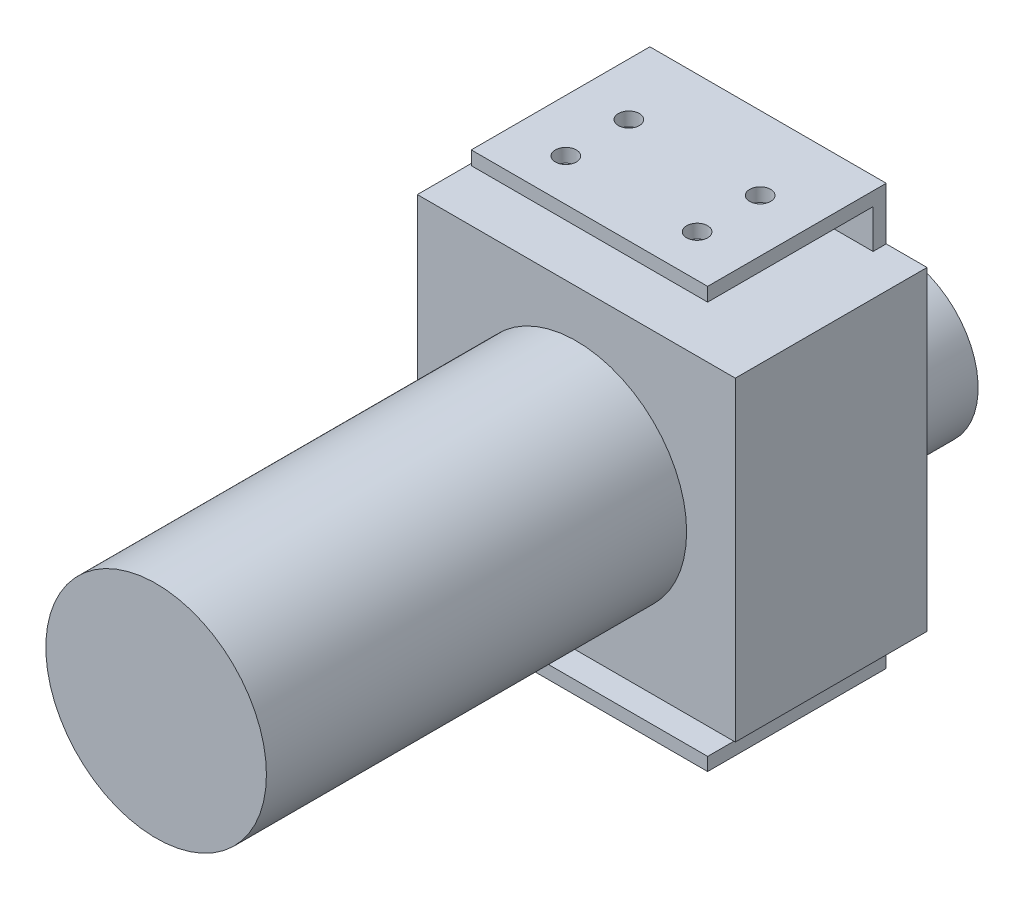
ISO-10303-21;
HEADER;
FILE_DESCRIPTION(('STEP AP214'),'2;1');
FILE_NAME('part.step','',(''),(''),'','','');
FILE_SCHEMA(('AUTOMOTIVE_DESIGN { 1 0 10303 214 1 1 1 1 }'));
ENDSEC;
DATA;
#1=APPLICATION_CONTEXT('core data for automotive mechanical design processes');
#2=APPLICATION_PROTOCOL_DEFINITION('international standard','automotive_design',2000,#1);
#3=PRODUCT_CONTEXT('',#1,'mechanical');
#4=PRODUCT('Part','Part','',(#3));
#5=PRODUCT_RELATED_PRODUCT_CATEGORY('part','',(#4));
#6=PRODUCT_DEFINITION_FORMATION('','',#4);
#7=PRODUCT_DEFINITION_CONTEXT('part definition',#1,'design');
#8=PRODUCT_DEFINITION('design','',#6,#7);
#9=PRODUCT_DEFINITION_SHAPE('','',#8);
#10=(LENGTH_UNIT() NAMED_UNIT(*) SI_UNIT(.MILLI.,.METRE.));
#11=(NAMED_UNIT(*) PLANE_ANGLE_UNIT() SI_UNIT($,.RADIAN.));
#12=(NAMED_UNIT(*) SI_UNIT($,.STERADIAN.) SOLID_ANGLE_UNIT());
#13=UNCERTAINTY_MEASURE_WITH_UNIT(LENGTH_MEASURE(1.E-05),#10,'distance_accuracy_value','');
#14=(GEOMETRIC_REPRESENTATION_CONTEXT(3) GLOBAL_UNCERTAINTY_ASSIGNED_CONTEXT((#13)) GLOBAL_UNIT_ASSIGNED_CONTEXT((#10,
#11,#12)) REPRESENTATION_CONTEXT('',''));
#15=CARTESIAN_POINT('',(0.,0.,0.));
#16=DIRECTION('',(0.,0.,1.));
#17=DIRECTION('',(1.,0.,0.));
#18=AXIS2_PLACEMENT_3D('',#15,#16,#17);
#19=CARTESIAN_POINT('',(0.,0.,2.5));
#20=DIRECTION('',(0.,0.,-1.));
#21=DIRECTION('',(-1.,0.,0.));
#22=AXIS2_PLACEMENT_3D('',#19,#20,#21);
#23=PLANE('',#22);
#24=DIRECTION('',(1.,0.,0.));
#25=VECTOR('',#24,1.);
#26=CARTESIAN_POINT('',(30.2680497080796,-30.,2.5));
#27=LINE('',#26,#25);
#28=CARTESIAN_POINT('',(-22.5,-30.,2.5));
#29=VERTEX_POINT('',#28);
#30=CARTESIAN_POINT('',(22.5,-30.,2.5));
#31=VERTEX_POINT('',#30);
#32=EDGE_CURVE('E200',#29,#31,#27,.T.);
#33=ORIENTED_EDGE('',*,*,#32,.F.);
#34=DIRECTION('',(0.,-1.,0.));
#35=VECTOR('',#34,1.);
#36=CARTESIAN_POINT('',(-22.5,-30.,2.5));
#37=LINE('',#36,#35);
#38=CARTESIAN_POINT('',(-22.5,-37.5,2.5));
#39=VERTEX_POINT('',#38);
#40=EDGE_CURVE('E253',#29,#39,#37,.T.);
#41=ORIENTED_EDGE('',*,*,#40,.T.);
#42=DIRECTION('',(-1.,0.,0.));
#43=VECTOR('',#42,1.);
#44=CARTESIAN_POINT('',(0.,-37.5,2.5));
#45=LINE('',#44,#43);
#46=CARTESIAN_POINT('',(22.5,-37.5,2.5));
#47=VERTEX_POINT('',#46);
#48=EDGE_CURVE('E64',#47,#39,#45,.T.);
#49=ORIENTED_EDGE('',*,*,#48,.F.);
#50=DIRECTION('',(0.,1.,0.));
#51=VECTOR('',#50,1.);
#52=CARTESIAN_POINT('',(22.5,-40.,2.5));
#53=LINE('',#52,#51);
#54=EDGE_CURVE('E121',#47,#31,#53,.T.);
#55=ORIENTED_EDGE('',*,*,#54,.T.);
#56=EDGE_LOOP('',(#33,#41,#49,#55));
#57=FACE_BOUND('',#56,.T.);
#58=ADVANCED_FACE('F47',(#57),#23,.F.);
#59=DIRECTION('',(-1.,0.,0.));
#60=VECTOR('',#59,1.);
#61=CARTESIAN_POINT('',(-30.2680497080796,30.,2.5));
#62=LINE('',#61,#60);
#63=CARTESIAN_POINT('',(22.5,30.,2.5));
#64=VERTEX_POINT('',#63);
#65=CARTESIAN_POINT('',(-22.5,30.,2.5));
#66=VERTEX_POINT('',#65);
#67=EDGE_CURVE('E197',#64,#66,#62,.T.);
#68=ORIENTED_EDGE('',*,*,#67,.F.);
#69=DIRECTION('',(0.,-1.,0.));
#70=VECTOR('',#69,1.);
#71=CARTESIAN_POINT('',(22.5,40.,2.5));
#72=LINE('',#71,#70);
#73=CARTESIAN_POINT('',(22.5,37.3974056643438,2.5));
#74=VERTEX_POINT('',#73);
#75=EDGE_CURVE('E248',#74,#64,#72,.T.);
#76=ORIENTED_EDGE('',*,*,#75,.F.);
#77=DIRECTION('',(-1.,0.,0.));
#78=VECTOR('',#77,1.);
#79=CARTESIAN_POINT('',(22.5,37.3974056643438,2.5));
#80=LINE('',#79,#78);
#81=CARTESIAN_POINT('',(-22.5,37.3974056643438,2.5));
#82=VERTEX_POINT('',#81);
#83=EDGE_CURVE('E214',#74,#82,#80,.T.);
#84=ORIENTED_EDGE('',*,*,#83,.T.);
#85=DIRECTION('',(0.,1.,0.));
#86=VECTOR('',#85,1.);
#87=CARTESIAN_POINT('',(-22.5,30.,2.5));
#88=LINE('',#87,#86);
#89=EDGE_CURVE('E251',#66,#82,#88,.T.);
#90=ORIENTED_EDGE('',*,*,#89,.F.);
#91=EDGE_LOOP('',(#68,#76,#84,#90));
#92=FACE_BOUND('',#91,.T.);
#93=ADVANCED_FACE('F378',(#92),#23,.F.);
#94=CARTESIAN_POINT('',(22.5,-40.,2.5));
#95=DIRECTION('',(-1.,0.,0.));
#96=DIRECTION('',(0.,0.,1.));
#97=AXIS2_PLACEMENT_3D('',#94,#95,#96);
#98=PLANE('',#97);
#99=DIRECTION('',(0.,1.,0.));
#100=VECTOR('',#99,1.);
#101=CARTESIAN_POINT('',(22.5,-40.,0.));
#102=LINE('',#101,#100);
#103=CARTESIAN_POINT('',(22.5,-40.,0.));
#104=VERTEX_POINT('',#103);
#105=CARTESIAN_POINT('',(22.5,-30.,0.));
#106=VERTEX_POINT('',#105);
#107=EDGE_CURVE('E246',#104,#106,#102,.T.);
#108=ORIENTED_EDGE('',*,*,#107,.T.);
#109=DIRECTION('',(0.,0.,-1.));
#110=VECTOR('',#109,1.);
#111=CARTESIAN_POINT('',(22.5,-30.,2.5));
#112=LINE('',#111,#110);
#113=EDGE_CURVE('E56',#31,#106,#112,.T.);
#114=ORIENTED_EDGE('',*,*,#113,.F.);
#115=ORIENTED_EDGE('',*,*,#54,.F.);
#116=DIRECTION('',(0.,0.,-1.));
#117=VECTOR('',#116,1.);
#118=CARTESIAN_POINT('',(22.5,-37.5,34.));
#119=LINE('',#118,#117);
#120=CARTESIAN_POINT('',(22.5,-37.5,34.));
#121=VERTEX_POINT('',#120);
#122=EDGE_CURVE('E243',#121,#47,#119,.T.);
#123=ORIENTED_EDGE('',*,*,#122,.F.);
#124=DIRECTION('',(0.,1.,0.));
#125=VECTOR('',#124,1.);
#126=CARTESIAN_POINT('',(22.5,0.,34.));
#127=LINE('',#126,#125);
#128=CARTESIAN_POINT('',(22.5,-40.,34.));
#129=VERTEX_POINT('',#128);
#130=EDGE_CURVE('E228',#129,#121,#127,.T.);
#131=ORIENTED_EDGE('',*,*,#130,.F.);
#132=DIRECTION('',(0.,0.,-1.));
#133=VECTOR('',#132,1.);
#134=CARTESIAN_POINT('',(22.5,-40.,2.5));
#135=LINE('',#134,#133);
#136=EDGE_CURVE('E255',#129,#104,#135,.T.);
#137=ORIENTED_EDGE('',*,*,#136,.T.);
#138=EDGE_LOOP('',(#108,#114,#115,#123,#131,#137));
#139=FACE_BOUND('',#138,.T.);
#140=ADVANCED_FACE('F49',(#139),#98,.F.);
#141=CARTESIAN_POINT('',(30.2680497080796,-30.,2.5));
#142=DIRECTION('',(-1.,0.,0.));
#143=DIRECTION('',(0.,0.,1.));
#144=AXIS2_PLACEMENT_3D('',#141,#142,#143);
#145=PLANE('',#144);
#146=DIRECTION('',(0.,1.,0.));
#147=VECTOR('',#146,1.);
#148=CARTESIAN_POINT('',(30.2680497080796,-30.,0.));
#149=LINE('',#148,#147);
#150=CARTESIAN_POINT('',(30.2680497080796,-30.,0.));
#151=VERTEX_POINT('',#150);
#152=CARTESIAN_POINT('',(30.2680497080796,30.,0.));
#153=VERTEX_POINT('',#152);
#154=EDGE_CURVE('E260',#151,#153,#149,.T.);
#155=ORIENTED_EDGE('',*,*,#154,.T.);
#156=DIRECTION('',(0.,0.,-1.));
#157=VECTOR('',#156,1.);
#158=CARTESIAN_POINT('',(30.2680497080796,30.,2.5));
#159=LINE('',#158,#157);
#160=CARTESIAN_POINT('',(30.2680497080796,30.,36.5));
#161=VERTEX_POINT('',#160);
#162=EDGE_CURVE('E297',#161,#153,#159,.T.);
#163=ORIENTED_EDGE('',*,*,#162,.F.);
#164=DIRECTION('',(0.,1.,0.));
#165=VECTOR('',#164,1.);
#166=CARTESIAN_POINT('',(30.2680497080796,30.,36.5));
#167=LINE('',#166,#165);
#168=CARTESIAN_POINT('',(30.2680497080796,-30.,36.5));
#169=VERTEX_POINT('',#168);
#170=EDGE_CURVE('E191',#169,#161,#167,.T.);
#171=ORIENTED_EDGE('',*,*,#170,.F.);
#172=DIRECTION('',(0.,0.,-1.));
#173=VECTOR('',#172,1.);
#174=CARTESIAN_POINT('',(30.2680497080796,-30.,2.5));
#175=LINE('',#174,#173);
#176=EDGE_CURVE('E187',#169,#151,#175,.T.);
#177=ORIENTED_EDGE('',*,*,#176,.T.);
#178=EDGE_LOOP('',(#155,#163,#171,#177));
#179=FACE_BOUND('',#178,.T.);
#180=ADVANCED_FACE('F416',(#179),#145,.F.);
#181=CARTESIAN_POINT('',(22.5,40.,2.5));
#182=DIRECTION('',(1.,0.,0.));
#183=DIRECTION('',(0.,0.,-1.));
#184=AXIS2_PLACEMENT_3D('',#181,#182,#183);
#185=PLANE('',#184);
#186=DIRECTION('',(0.,-1.,0.));
#187=VECTOR('',#186,1.);
#188=CARTESIAN_POINT('',(22.5,40.,0.));
#189=LINE('',#188,#187);
#190=CARTESIAN_POINT('',(22.5,40.,0.));
#191=VERTEX_POINT('',#190);
#192=CARTESIAN_POINT('',(22.5,30.,0.));
#193=VERTEX_POINT('',#192);
#194=EDGE_CURVE('E266',#191,#193,#189,.T.);
#195=ORIENTED_EDGE('',*,*,#194,.F.);
#196=DIRECTION('',(0.,0.,-1.));
#197=VECTOR('',#196,1.);
#198=CARTESIAN_POINT('',(22.5,40.,2.5));
#199=LINE('',#198,#197);
#200=CARTESIAN_POINT('',(22.5,40.,34.));
#201=VERTEX_POINT('',#200);
#202=EDGE_CURVE('E293',#201,#191,#199,.T.);
#203=ORIENTED_EDGE('',*,*,#202,.F.);
#204=DIRECTION('',(0.,-1.,0.));
#205=VECTOR('',#204,1.);
#206=CARTESIAN_POINT('',(22.5,40.,34.));
#207=LINE('',#206,#205);
#208=CARTESIAN_POINT('',(22.5,37.3974056643438,34.));
#209=VERTEX_POINT('',#208);
#210=EDGE_CURVE('E212',#201,#209,#207,.T.);
#211=ORIENTED_EDGE('',*,*,#210,.T.);
#212=DIRECTION('',(0.,0.,-1.));
#213=VECTOR('',#212,1.);
#214=CARTESIAN_POINT('',(22.5,37.3974056643438,34.));
#215=LINE('',#214,#213);
#216=EDGE_CURVE('E206',#209,#74,#215,.T.);
#217=ORIENTED_EDGE('',*,*,#216,.T.);
#218=ORIENTED_EDGE('',*,*,#75,.T.);
#219=DIRECTION('',(0.,0.,-1.));
#220=VECTOR('',#219,1.);
#221=CARTESIAN_POINT('',(22.5,30.,2.5));
#222=LINE('',#221,#220);
#223=EDGE_CURVE('E295',#64,#193,#222,.T.);
#224=ORIENTED_EDGE('',*,*,#223,.T.);
#225=EDGE_LOOP('',(#195,#203,#211,#217,#218,#224));
#226=FACE_BOUND('',#225,.T.);
#227=ADVANCED_FACE('F413',(#226),#185,.T.);
#228=CARTESIAN_POINT('',(-22.5,40.,2.5));
#229=DIRECTION('',(0.,1.,0.));
#230=DIRECTION('',(0.,0.,1.));
#231=AXIS2_PLACEMENT_3D('',#228,#229,#230);
#232=PLANE('',#231);
#233=CARTESIAN_POINT('',(12.5,40.,14.));
#234=DIRECTION('',(0.,1.,0.));
#235=DIRECTION('',(0.,0.,1.));
#236=AXIS2_PLACEMENT_3D('',#233,#234,#235);
#237=CIRCLE('',#236,2.);
#238=CARTESIAN_POINT('',(12.5,40.,16.));
#239=VERTEX_POINT('',#238);
#240=EDGE_CURVE('E336',#239,#239,#237,.T.);
#241=ORIENTED_EDGE('',*,*,#240,.F.);
#242=EDGE_LOOP('',(#241));
#243=FACE_BOUND('',#242,.T.);
#244=CARTESIAN_POINT('',(-12.5,40.,26.));
#245=DIRECTION('',(0.,1.,0.));
#246=DIRECTION('',(0.,0.,1.));
#247=AXIS2_PLACEMENT_3D('',#244,#245,#246);
#248=CIRCLE('',#247,2.);
#249=CARTESIAN_POINT('',(-12.5,40.,28.));
#250=VERTEX_POINT('',#249);
#251=EDGE_CURVE('E331',#250,#250,#248,.T.);
#252=ORIENTED_EDGE('',*,*,#251,.F.);
#253=EDGE_LOOP('',(#252));
#254=FACE_BOUND('',#253,.T.);
#255=CARTESIAN_POINT('',(12.5,40.,26.));
#256=DIRECTION('',(0.,1.,0.));
#257=DIRECTION('',(0.,0.,1.));
#258=AXIS2_PLACEMENT_3D('',#255,#256,#257);
#259=CIRCLE('',#258,2.);
#260=CARTESIAN_POINT('',(12.5,40.,28.));
#261=VERTEX_POINT('',#260);
#262=EDGE_CURVE('E327',#261,#261,#259,.T.);
#263=ORIENTED_EDGE('',*,*,#262,.F.);
#264=EDGE_LOOP('',(#263));
#265=FACE_BOUND('',#264,.T.);
#266=CARTESIAN_POINT('',(-12.5,40.,14.));
#267=DIRECTION('',(0.,1.,0.));
#268=DIRECTION('',(0.,0.,1.));
#269=AXIS2_PLACEMENT_3D('',#266,#267,#268);
#270=CIRCLE('',#269,2.);
#271=CARTESIAN_POINT('',(-12.5,40.,16.));
#272=VERTEX_POINT('',#271);
#273=EDGE_CURVE('E306',#272,#272,#270,.T.);
#274=ORIENTED_EDGE('',*,*,#273,.F.);
#275=EDGE_LOOP('',(#274));
#276=FACE_BOUND('',#275,.T.);
#277=DIRECTION('',(1.,0.,0.));
#278=VECTOR('',#277,1.);
#279=CARTESIAN_POINT('',(-22.5,40.,0.));
#280=LINE('',#279,#278);
#281=CARTESIAN_POINT('',(-22.5,40.,0.));
#282=VERTEX_POINT('',#281);
#283=EDGE_CURVE('E269',#282,#191,#280,.T.);
#284=ORIENTED_EDGE('',*,*,#283,.F.);
#285=DIRECTION('',(0.,0.,-1.));
#286=VECTOR('',#285,1.);
#287=CARTESIAN_POINT('',(-22.5,40.,2.5));
#288=LINE('',#287,#286);
#289=CARTESIAN_POINT('',(-22.5,40.,34.));
#290=VERTEX_POINT('',#289);
#291=EDGE_CURVE('E291',#290,#282,#288,.T.);
#292=ORIENTED_EDGE('',*,*,#291,.F.);
#293=DIRECTION('',(1.,0.,0.));
#294=VECTOR('',#293,1.);
#295=CARTESIAN_POINT('',(-22.5,40.,34.));
#296=LINE('',#295,#294);
#297=EDGE_CURVE('E220',#290,#201,#296,.T.);
#298=ORIENTED_EDGE('',*,*,#297,.T.);
#299=ORIENTED_EDGE('',*,*,#202,.T.);
#300=EDGE_LOOP('',(#284,#292,#298,#299));
#301=FACE_BOUND('',#300,.T.);
#302=ADVANCED_FACE('F410',(#243,#254,#265,#276,#301),#232,.T.);
#303=CARTESIAN_POINT('',(-22.5,30.,2.5));
#304=DIRECTION('',(-1.,0.,0.));
#305=DIRECTION('',(0.,0.,1.));
#306=AXIS2_PLACEMENT_3D('',#303,#304,#305);
#307=PLANE('',#306);
#308=DIRECTION('',(0.,1.,0.));
#309=VECTOR('',#308,1.);
#310=CARTESIAN_POINT('',(-22.5,30.,0.));
#311=LINE('',#310,#309);
#312=CARTESIAN_POINT('',(-22.5,30.,0.));
#313=VERTEX_POINT('',#312);
#314=EDGE_CURVE('E272',#313,#282,#311,.T.);
#315=ORIENTED_EDGE('',*,*,#314,.F.);
#316=DIRECTION('',(0.,0.,-1.));
#317=VECTOR('',#316,1.);
#318=CARTESIAN_POINT('',(-22.5,30.,2.5));
#319=LINE('',#318,#317);
#320=EDGE_CURVE('E73',#66,#313,#319,.T.);
#321=ORIENTED_EDGE('',*,*,#320,.F.);
#322=ORIENTED_EDGE('',*,*,#89,.T.);
#323=DIRECTION('',(0.,0.,-1.));
#324=VECTOR('',#323,1.);
#325=CARTESIAN_POINT('',(-22.5,37.3974056643438,34.));
#326=LINE('',#325,#324);
#327=CARTESIAN_POINT('',(-22.5,37.3974056643438,34.));
#328=VERTEX_POINT('',#327);
#329=EDGE_CURVE('E210',#328,#82,#326,.T.);
#330=ORIENTED_EDGE('',*,*,#329,.F.);
#331=DIRECTION('',(0.,1.,0.));
#332=VECTOR('',#331,1.);
#333=CARTESIAN_POINT('',(-22.5,37.3974056643438,34.));
#334=LINE('',#333,#332);
#335=EDGE_CURVE('E223',#328,#290,#334,.T.);
#336=ORIENTED_EDGE('',*,*,#335,.T.);
#337=ORIENTED_EDGE('',*,*,#291,.T.);
#338=EDGE_LOOP('',(#315,#321,#322,#330,#336,#337));
#339=FACE_BOUND('',#338,.T.);
#340=ADVANCED_FACE('F406',(#339),#307,.T.);
#341=CARTESIAN_POINT('',(-30.2680497080796,30.,2.5));
#342=DIRECTION('',(0.,1.,0.));
#343=DIRECTION('',(0.,0.,1.));
#344=AXIS2_PLACEMENT_3D('',#341,#342,#343);
#345=PLANE('',#344);
#346=DIRECTION('',(1.,0.,0.));
#347=VECTOR('',#346,1.);
#348=CARTESIAN_POINT('',(-30.2680497080796,30.,0.));
#349=LINE('',#348,#347);
#350=CARTESIAN_POINT('',(-30.2680497080796,30.,0.));
#351=VERTEX_POINT('',#350);
#352=EDGE_CURVE('E275',#351,#313,#349,.T.);
#353=ORIENTED_EDGE('',*,*,#352,.F.);
#354=DIRECTION('',(0.,0.,-1.));
#355=VECTOR('',#354,1.);
#356=CARTESIAN_POINT('',(-30.2680497080796,30.,2.5));
#357=LINE('',#356,#355);
#358=CARTESIAN_POINT('',(-30.2680497080796,30.,36.5));
#359=VERTEX_POINT('',#358);
#360=EDGE_CURVE('E180',#359,#351,#357,.T.);
#361=ORIENTED_EDGE('',*,*,#360,.F.);
#362=DIRECTION('',(-1.,0.,0.));
#363=VECTOR('',#362,1.);
#364=CARTESIAN_POINT('',(-30.2680497080796,30.,36.5));
#365=LINE('',#364,#363);
#366=EDGE_CURVE('E196',#161,#359,#365,.T.);
#367=ORIENTED_EDGE('',*,*,#366,.F.);
#368=ORIENTED_EDGE('',*,*,#162,.T.);
#369=DIRECTION('',(1.,0.,0.));
#370=VECTOR('',#369,1.);
#371=CARTESIAN_POINT('',(22.5,30.,0.));
#372=LINE('',#371,#370);
#373=EDGE_CURVE('E263',#193,#153,#372,.T.);
#374=ORIENTED_EDGE('',*,*,#373,.F.);
#375=ORIENTED_EDGE('',*,*,#223,.F.);
#376=ORIENTED_EDGE('',*,*,#67,.T.);
#377=ORIENTED_EDGE('',*,*,#320,.T.);
#378=EDGE_LOOP('',(#353,#361,#367,#368,#374,#375,#376,#377));
#379=FACE_BOUND('',#378,.T.);
#380=ADVANCED_FACE('F403',(#379),#345,.T.);
#381=CARTESIAN_POINT('',(-30.2680497080796,-30.,2.5));
#382=DIRECTION('',(-1.,0.,0.));
#383=DIRECTION('',(0.,0.,1.));
#384=AXIS2_PLACEMENT_3D('',#381,#382,#383);
#385=PLANE('',#384);
#386=DIRECTION('',(0.,1.,0.));
#387=VECTOR('',#386,1.);
#388=CARTESIAN_POINT('',(-30.2680497080796,-30.,0.));
#389=LINE('',#388,#387);
#390=CARTESIAN_POINT('',(-30.2680497080796,-30.,0.));
#391=VERTEX_POINT('',#390);
#392=EDGE_CURVE('E177',#391,#351,#389,.T.);
#393=ORIENTED_EDGE('',*,*,#392,.F.);
#394=DIRECTION('',(0.,0.,-1.));
#395=VECTOR('',#394,1.);
#396=CARTESIAN_POINT('',(-30.2680497080796,-30.,2.5));
#397=LINE('',#396,#395);
#398=CARTESIAN_POINT('',(-30.2680497080796,-30.,36.5));
#399=VERTEX_POINT('',#398);
#400=EDGE_CURVE('E171',#399,#391,#397,.T.);
#401=ORIENTED_EDGE('',*,*,#400,.F.);
#402=DIRECTION('',(0.,-1.,0.));
#403=VECTOR('',#402,1.);
#404=CARTESIAN_POINT('',(-30.2680497080796,-30.,36.5));
#405=LINE('',#404,#403);
#406=EDGE_CURVE('E175',#359,#399,#405,.T.);
#407=ORIENTED_EDGE('',*,*,#406,.F.);
#408=ORIENTED_EDGE('',*,*,#360,.T.);
#409=EDGE_LOOP('',(#393,#401,#407,#408));
#410=FACE_BOUND('',#409,.T.);
#411=ADVANCED_FACE('F173',(#410),#385,.T.);
#412=CARTESIAN_POINT('',(-30.2680497080796,-30.,2.5));
#413=DIRECTION('',(0.,1.,0.));
#414=DIRECTION('',(0.,0.,1.));
#415=AXIS2_PLACEMENT_3D('',#412,#413,#414);
#416=PLANE('',#415);
#417=DIRECTION('',(1.,0.,0.));
#418=VECTOR('',#417,1.);
#419=CARTESIAN_POINT('',(-30.2680497080796,-30.,0.));
#420=LINE('',#419,#418);
#421=CARTESIAN_POINT('',(-22.5,-30.,0.));
#422=VERTEX_POINT('',#421);
#423=EDGE_CURVE('E279',#391,#422,#420,.T.);
#424=ORIENTED_EDGE('',*,*,#423,.T.);
#425=DIRECTION('',(0.,0.,-1.));
#426=VECTOR('',#425,1.);
#427=CARTESIAN_POINT('',(-22.5,-30.,2.5));
#428=LINE('',#427,#426);
#429=EDGE_CURVE('E181',#29,#422,#428,.T.);
#430=ORIENTED_EDGE('',*,*,#429,.F.);
#431=ORIENTED_EDGE('',*,*,#32,.T.);
#432=ORIENTED_EDGE('',*,*,#113,.T.);
#433=DIRECTION('',(1.,0.,0.));
#434=VECTOR('',#433,1.);
#435=CARTESIAN_POINT('',(22.5,-30.,0.));
#436=LINE('',#435,#434);
#437=EDGE_CURVE('E258',#106,#151,#436,.T.);
#438=ORIENTED_EDGE('',*,*,#437,.T.);
#439=ORIENTED_EDGE('',*,*,#176,.F.);
#440=DIRECTION('',(1.,0.,0.));
#441=VECTOR('',#440,1.);
#442=CARTESIAN_POINT('',(30.2680497080796,-30.,36.5));
#443=LINE('',#442,#441);
#444=EDGE_CURVE('E184',#399,#169,#443,.T.);
#445=ORIENTED_EDGE('',*,*,#444,.F.);
#446=ORIENTED_EDGE('',*,*,#400,.T.);
#447=EDGE_LOOP('',(#424,#430,#431,#432,#438,#439,#445,#446));
#448=FACE_BOUND('',#447,.T.);
#449=ADVANCED_FACE('F185',(#448),#416,.F.);
#450=CARTESIAN_POINT('',(-22.5,-30.,2.5));
#451=DIRECTION('',(1.,0.,0.));
#452=DIRECTION('',(0.,0.,-1.));
#453=AXIS2_PLACEMENT_3D('',#450,#451,#452);
#454=PLANE('',#453);
#455=DIRECTION('',(0.,-1.,0.));
#456=VECTOR('',#455,1.);
#457=CARTESIAN_POINT('',(-22.5,-30.,0.));
#458=LINE('',#457,#456);
#459=CARTESIAN_POINT('',(-22.5,-40.,0.));
#460=VERTEX_POINT('',#459);
#461=EDGE_CURVE('E281',#422,#460,#458,.T.);
#462=ORIENTED_EDGE('',*,*,#461,.T.);
#463=DIRECTION('',(0.,0.,-1.));
#464=VECTOR('',#463,1.);
#465=CARTESIAN_POINT('',(-22.5,-40.,2.5));
#466=LINE('',#465,#464);
#467=CARTESIAN_POINT('',(-22.5,-40.,34.));
#468=VERTEX_POINT('',#467);
#469=EDGE_CURVE('E285',#468,#460,#466,.T.);
#470=ORIENTED_EDGE('',*,*,#469,.F.);
#471=DIRECTION('',(0.,-1.,0.));
#472=VECTOR('',#471,1.);
#473=CARTESIAN_POINT('',(-22.5,0.,34.));
#474=LINE('',#473,#472);
#475=CARTESIAN_POINT('',(-22.5,-37.5,34.));
#476=VERTEX_POINT('',#475);
#477=EDGE_CURVE('E233',#476,#468,#474,.T.);
#478=ORIENTED_EDGE('',*,*,#477,.F.);
#479=DIRECTION('',(0.,0.,-1.));
#480=VECTOR('',#479,1.);
#481=CARTESIAN_POINT('',(-22.5,-37.5,34.));
#482=LINE('',#481,#480);
#483=EDGE_CURVE('E239',#476,#39,#482,.T.);
#484=ORIENTED_EDGE('',*,*,#483,.T.);
#485=ORIENTED_EDGE('',*,*,#40,.F.);
#486=ORIENTED_EDGE('',*,*,#429,.T.);
#487=EDGE_LOOP('',(#462,#470,#478,#484,#485,#486));
#488=FACE_BOUND('',#487,.T.);
#489=ADVANCED_FACE('F395',(#488),#454,.F.);
#490=CARTESIAN_POINT('',(-22.5,-40.,2.5));
#491=DIRECTION('',(0.,1.,0.));
#492=DIRECTION('',(0.,0.,1.));
#493=AXIS2_PLACEMENT_3D('',#490,#491,#492);
#494=PLANE('',#493);
#495=CARTESIAN_POINT('',(-12.5,-40.,26.));
#496=DIRECTION('',(0.,-1.,0.));
#497=DIRECTION('',(0.,0.,-1.));
#498=AXIS2_PLACEMENT_3D('',#495,#496,#497);
#499=CIRCLE('',#498,2.);
#500=CARTESIAN_POINT('',(-12.5,-40.,24.));
#501=VERTEX_POINT('',#500);
#502=EDGE_CURVE('E718',#501,#501,#499,.T.);
#503=ORIENTED_EDGE('',*,*,#502,.F.);
#504=EDGE_LOOP('',(#503));
#505=FACE_BOUND('',#504,.T.);
#506=CARTESIAN_POINT('',(-12.5,-40.,14.));
#507=DIRECTION('',(0.,-1.,0.));
#508=DIRECTION('',(0.,0.,-1.));
#509=AXIS2_PLACEMENT_3D('',#506,#507,#508);
#510=CIRCLE('',#509,2.);
#511=CARTESIAN_POINT('',(-12.5,-40.,12.));
#512=VERTEX_POINT('',#511);
#513=EDGE_CURVE('E719',#512,#512,#510,.T.);
#514=ORIENTED_EDGE('',*,*,#513,.F.);
#515=EDGE_LOOP('',(#514));
#516=FACE_BOUND('',#515,.T.);
#517=CARTESIAN_POINT('',(12.5,-40.,14.));
#518=DIRECTION('',(0.,-1.,0.));
#519=DIRECTION('',(0.,0.,-1.));
#520=AXIS2_PLACEMENT_3D('',#517,#518,#519);
#521=CIRCLE('',#520,2.);
#522=CARTESIAN_POINT('',(12.5,-40.,12.));
#523=VERTEX_POINT('',#522);
#524=EDGE_CURVE('E721',#523,#523,#521,.T.);
#525=ORIENTED_EDGE('',*,*,#524,.F.);
#526=EDGE_LOOP('',(#525));
#527=FACE_BOUND('',#526,.T.);
#528=CARTESIAN_POINT('',(12.5,-40.,26.));
#529=DIRECTION('',(0.,-1.,0.));
#530=DIRECTION('',(0.,0.,-1.));
#531=AXIS2_PLACEMENT_3D('',#528,#529,#530);
#532=CIRCLE('',#531,2.);
#533=CARTESIAN_POINT('',(12.5,-40.,24.));
#534=VERTEX_POINT('',#533);
#535=EDGE_CURVE('E320',#534,#534,#532,.T.);
#536=ORIENTED_EDGE('',*,*,#535,.F.);
#537=EDGE_LOOP('',(#536));
#538=FACE_BOUND('',#537,.T.);
#539=DIRECTION('',(1.,0.,0.));
#540=VECTOR('',#539,1.);
#541=CARTESIAN_POINT('',(-22.5,-40.,0.));
#542=LINE('',#541,#540);
#543=EDGE_CURVE('E118',#460,#104,#542,.T.);
#544=ORIENTED_EDGE('',*,*,#543,.T.);
#545=ORIENTED_EDGE('',*,*,#136,.F.);
#546=DIRECTION('',(1.,0.,0.));
#547=VECTOR('',#546,1.);
#548=CARTESIAN_POINT('',(0.,-40.,34.));
#549=LINE('',#548,#547);
#550=EDGE_CURVE('E236',#468,#129,#549,.T.);
#551=ORIENTED_EDGE('',*,*,#550,.F.);
#552=ORIENTED_EDGE('',*,*,#469,.T.);
#553=EDGE_LOOP('',(#544,#545,#551,#552));
#554=FACE_BOUND('',#553,.T.);
#555=ADVANCED_FACE('F391',(#505,#516,#527,#538,#554),#494,.F.);
#556=CARTESIAN_POINT('',(0.,0.,0.));
#557=DIRECTION('',(0.,0.,-1.));
#558=DIRECTION('',(-1.,0.,0.));
#559=AXIS2_PLACEMENT_3D('',#556,#557,#558);
#560=PLANE('',#559);
#561=CARTESIAN_POINT('',(0.,-9.99999999999999,0.));
#562=DIRECTION('',(0.,0.,-1.));
#563=DIRECTION('',(-1.,0.,0.));
#564=AXIS2_PLACEMENT_3D('',#561,#562,#563);
#565=CIRCLE('',#564,4.);
#566=CARTESIAN_POINT('',(-4.,-9.99999999999999,0.));
#567=VERTEX_POINT('',#566);
#568=EDGE_CURVE('E348',#567,#567,#565,.T.);
#569=ORIENTED_EDGE('',*,*,#568,.F.);
#570=EDGE_LOOP('',(#569));
#571=FACE_BOUND('',#570,.T.);
#572=ORIENTED_EDGE('',*,*,#107,.F.);
#573=ORIENTED_EDGE('',*,*,#543,.F.);
#574=ORIENTED_EDGE('',*,*,#461,.F.);
#575=ORIENTED_EDGE('',*,*,#423,.F.);
#576=ORIENTED_EDGE('',*,*,#392,.T.);
#577=ORIENTED_EDGE('',*,*,#352,.T.);
#578=ORIENTED_EDGE('',*,*,#314,.T.);
#579=ORIENTED_EDGE('',*,*,#283,.T.);
#580=ORIENTED_EDGE('',*,*,#194,.T.);
#581=ORIENTED_EDGE('',*,*,#373,.T.);
#582=ORIENTED_EDGE('',*,*,#154,.F.);
#583=ORIENTED_EDGE('',*,*,#437,.F.);
#584=EDGE_LOOP('',(#572,#573,#574,#575,#576,#577,#578,#579,#580,#581,#582,#583));
#585=FACE_BOUND('',#584,.T.);
#586=ADVANCED_FACE('F388',(#571,#585),#560,.T.);
#587=CARTESIAN_POINT('',(0.,-37.5,34.));
#588=DIRECTION('',(0.,-1.,0.));
#589=DIRECTION('',(0.,0.,-1.));
#590=AXIS2_PLACEMENT_3D('',#587,#588,#589);
#591=PLANE('',#590);
#592=CARTESIAN_POINT('',(-12.5,-37.5,26.));
#593=DIRECTION('',(0.,-1.,0.));
#594=DIRECTION('',(0.,0.,-1.));
#595=AXIS2_PLACEMENT_3D('',#592,#593,#594);
#596=CIRCLE('',#595,2.);
#597=CARTESIAN_POINT('',(-12.5,-37.5,24.));
#598=VERTEX_POINT('',#597);
#599=EDGE_CURVE('E51',#598,#598,#596,.T.);
#600=ORIENTED_EDGE('',*,*,#599,.T.);
#601=EDGE_LOOP('',(#600));
#602=FACE_BOUND('',#601,.T.);
#603=CARTESIAN_POINT('',(-12.5,-37.5,14.));
#604=DIRECTION('',(0.,-1.,0.));
#605=DIRECTION('',(0.,0.,-1.));
#606=AXIS2_PLACEMENT_3D('',#603,#604,#605);
#607=CIRCLE('',#606,2.);
#608=CARTESIAN_POINT('',(-12.5,-37.5,12.));
#609=VERTEX_POINT('',#608);
#610=EDGE_CURVE('E322',#609,#609,#607,.T.);
#611=ORIENTED_EDGE('',*,*,#610,.T.);
#612=EDGE_LOOP('',(#611));
#613=FACE_BOUND('',#612,.T.);
#614=CARTESIAN_POINT('',(12.5,-37.5,14.));
#615=DIRECTION('',(0.,-1.,0.));
#616=DIRECTION('',(0.,0.,-1.));
#617=AXIS2_PLACEMENT_3D('',#614,#615,#616);
#618=CIRCLE('',#617,2.);
#619=CARTESIAN_POINT('',(12.5,-37.5,12.));
#620=VERTEX_POINT('',#619);
#621=EDGE_CURVE('E319',#620,#620,#618,.T.);
#622=ORIENTED_EDGE('',*,*,#621,.T.);
#623=EDGE_LOOP('',(#622));
#624=FACE_BOUND('',#623,.T.);
#625=CARTESIAN_POINT('',(12.5,-37.5,26.));
#626=DIRECTION('',(0.,-1.,0.));
#627=DIRECTION('',(0.,0.,-1.));
#628=AXIS2_PLACEMENT_3D('',#625,#626,#627);
#629=CIRCLE('',#628,2.);
#630=CARTESIAN_POINT('',(12.5,-37.5,24.));
#631=VERTEX_POINT('',#630);
#632=EDGE_CURVE('E316',#631,#631,#629,.T.);
#633=ORIENTED_EDGE('',*,*,#632,.T.);
#634=EDGE_LOOP('',(#633));
#635=FACE_BOUND('',#634,.T.);
#636=ORIENTED_EDGE('',*,*,#48,.T.);
#637=ORIENTED_EDGE('',*,*,#483,.F.);
#638=DIRECTION('',(-1.,0.,0.));
#639=VECTOR('',#638,1.);
#640=CARTESIAN_POINT('',(0.,-37.5,34.));
#641=LINE('',#640,#639);
#642=EDGE_CURVE('E231',#121,#476,#641,.T.);
#643=ORIENTED_EDGE('',*,*,#642,.F.);
#644=ORIENTED_EDGE('',*,*,#122,.T.);
#645=EDGE_LOOP('',(#636,#637,#643,#644));
#646=FACE_BOUND('',#645,.T.);
#647=ADVANCED_FACE('F386',(#602,#613,#624,#635,#646),#591,.F.);
#648=CARTESIAN_POINT('',(0.,0.,34.));
#649=DIRECTION('',(0.,0.,1.));
#650=DIRECTION('',(1.,0.,0.));
#651=AXIS2_PLACEMENT_3D('',#648,#649,#650);
#652=PLANE('',#651);
#653=ORIENTED_EDGE('',*,*,#130,.T.);
#654=ORIENTED_EDGE('',*,*,#642,.T.);
#655=ORIENTED_EDGE('',*,*,#477,.T.);
#656=ORIENTED_EDGE('',*,*,#550,.T.);
#657=EDGE_LOOP('',(#653,#654,#655,#656));
#658=FACE_BOUND('',#657,.T.);
#659=ADVANCED_FACE('F440',(#658),#652,.T.);
#660=CARTESIAN_POINT('',(22.5,37.3974056643438,34.));
#661=DIRECTION('',(0.,-1.,0.));
#662=DIRECTION('',(1.,0.,0.));
#663=AXIS2_PLACEMENT_3D('',#660,#661,#662);
#664=PLANE('',#663);
#665=CARTESIAN_POINT('',(12.5,37.3974056643438,14.));
#666=DIRECTION('',(0.,-1.,0.));
#667=DIRECTION('',(1.,0.,0.));
#668=AXIS2_PLACEMENT_3D('',#665,#666,#667);
#669=CIRCLE('',#668,2.);
#670=CARTESIAN_POINT('',(14.5,37.3974056643438,14.));
#671=VERTEX_POINT('',#670);
#672=EDGE_CURVE('E312',#671,#671,#669,.T.);
#673=ORIENTED_EDGE('',*,*,#672,.F.);
#674=EDGE_LOOP('',(#673));
#675=FACE_BOUND('',#674,.T.);
#676=CARTESIAN_POINT('',(-12.5,37.3974056643438,26.));
#677=DIRECTION('',(0.,-1.,0.));
#678=DIRECTION('',(1.,0.,0.));
#679=AXIS2_PLACEMENT_3D('',#676,#677,#678);
#680=CIRCLE('',#679,2.);
#681=CARTESIAN_POINT('',(-10.5,37.3974056643438,26.));
#682=VERTEX_POINT('',#681);
#683=EDGE_CURVE('E309',#682,#682,#680,.T.);
#684=ORIENTED_EDGE('',*,*,#683,.F.);
#685=EDGE_LOOP('',(#684));
#686=FACE_BOUND('',#685,.T.);
#687=CARTESIAN_POINT('',(12.5,37.3974056643438,26.));
#688=DIRECTION('',(0.,-1.,0.));
#689=DIRECTION('',(1.,0.,0.));
#690=AXIS2_PLACEMENT_3D('',#687,#688,#689);
#691=CIRCLE('',#690,2.);
#692=CARTESIAN_POINT('',(14.5,37.3974056643438,26.));
#693=VERTEX_POINT('',#692);
#694=EDGE_CURVE('E305',#693,#693,#691,.T.);
#695=ORIENTED_EDGE('',*,*,#694,.F.);
#696=EDGE_LOOP('',(#695));
#697=FACE_BOUND('',#696,.T.);
#698=CARTESIAN_POINT('',(-12.5,37.3974056643438,14.));
#699=DIRECTION('',(0.,-1.,0.));
#700=DIRECTION('',(1.,0.,0.));
#701=AXIS2_PLACEMENT_3D('',#698,#699,#700);
#702=CIRCLE('',#701,2.);
#703=CARTESIAN_POINT('',(-10.5,37.3974056643438,14.));
#704=VERTEX_POINT('',#703);
#705=EDGE_CURVE('E302',#704,#704,#702,.T.);
#706=ORIENTED_EDGE('',*,*,#705,.F.);
#707=EDGE_LOOP('',(#706));
#708=FACE_BOUND('',#707,.T.);
#709=ORIENTED_EDGE('',*,*,#83,.F.);
#710=ORIENTED_EDGE('',*,*,#216,.F.);
#711=DIRECTION('',(-1.,0.,0.));
#712=VECTOR('',#711,1.);
#713=CARTESIAN_POINT('',(22.5,37.3974056643438,34.));
#714=LINE('',#713,#712);
#715=EDGE_CURVE('E217',#209,#328,#714,.T.);
#716=ORIENTED_EDGE('',*,*,#715,.T.);
#717=ORIENTED_EDGE('',*,*,#329,.T.);
#718=EDGE_LOOP('',(#709,#710,#716,#717));
#719=FACE_BOUND('',#718,.T.);
#720=ADVANCED_FACE('F373',(#675,#686,#697,#708,#719),#664,.T.);
#721=CARTESIAN_POINT('',(0.,0.,34.));
#722=DIRECTION('',(0.,0.,-1.));
#723=DIRECTION('',(-1.,0.,0.));
#724=AXIS2_PLACEMENT_3D('',#721,#722,#723);
#725=PLANE('',#724);
#726=ORIENTED_EDGE('',*,*,#715,.F.);
#727=ORIENTED_EDGE('',*,*,#210,.F.);
#728=ORIENTED_EDGE('',*,*,#297,.F.);
#729=ORIENTED_EDGE('',*,*,#335,.F.);
#730=EDGE_LOOP('',(#726,#727,#728,#729));
#731=FACE_BOUND('',#730,.T.);
#732=ADVANCED_FACE('F367',(#731),#725,.F.);
#733=CARTESIAN_POINT('',(0.,0.,36.5));
#734=DIRECTION('',(0.,0.,-1.));
#735=DIRECTION('',(-1.,0.,0.));
#736=AXIS2_PLACEMENT_3D('',#733,#734,#735);
#737=PLANE('',#736);
#738=CARTESIAN_POINT('',(0.,0.,36.5));
#739=DIRECTION('',(0.,0.,1.));
#740=DIRECTION('',(1.,0.,0.));
#741=AXIS2_PLACEMENT_3D('',#738,#739,#740);
#742=CIRCLE('',#741,21.);
#743=CARTESIAN_POINT('',(21.,0.,36.5));
#744=VERTEX_POINT('',#743);
#745=EDGE_CURVE('E11',#744,#744,#742,.T.);
#746=ORIENTED_EDGE('',*,*,#745,.F.);
#747=EDGE_LOOP('',(#746));
#748=FACE_BOUND('',#747,.T.);
#749=ORIENTED_EDGE('',*,*,#406,.T.);
#750=ORIENTED_EDGE('',*,*,#444,.T.);
#751=ORIENTED_EDGE('',*,*,#170,.T.);
#752=ORIENTED_EDGE('',*,*,#366,.T.);
#753=EDGE_LOOP('',(#749,#750,#751,#752));
#754=FACE_BOUND('',#753,.T.);
#755=ADVANCED_FACE('F194',(#748,#754),#737,.F.);
#756=CARTESIAN_POINT('',(0.,0.,116.5));
#757=DIRECTION('',(0.,0.,-1.));
#758=DIRECTION('',(-1.,0.,0.));
#759=AXIS2_PLACEMENT_3D('',#756,#757,#758);
#760=CYLINDRICAL_SURFACE('',#759,21.);
#761=CARTESIAN_POINT('',(0.,0.,116.5));
#762=DIRECTION('',(0.,0.,1.));
#763=DIRECTION('',(1.,0.,0.));
#764=AXIS2_PLACEMENT_3D('',#761,#762,#763);
#765=CIRCLE('',#764,21.);
#766=CARTESIAN_POINT('',(21.,0.,116.5));
#767=VERTEX_POINT('',#766);
#768=EDGE_CURVE('E208',#767,#767,#765,.T.);
#769=ORIENTED_EDGE('',*,*,#768,.F.);
#770=EDGE_LOOP('',(#769));
#771=FACE_BOUND('',#770,.T.);
#772=ORIENTED_EDGE('',*,*,#745,.T.);
#773=EDGE_LOOP('',(#772));
#774=FACE_BOUND('',#773,.T.);
#775=ADVANCED_FACE('F360',(#771,#774),#760,.T.);
#776=CARTESIAN_POINT('',(0.,0.,116.5));
#777=DIRECTION('',(0.,0.,1.));
#778=DIRECTION('',(1.,0.,0.));
#779=AXIS2_PLACEMENT_3D('',#776,#777,#778);
#780=PLANE('',#779);
#781=ORIENTED_EDGE('',*,*,#768,.T.);
#782=EDGE_LOOP('',(#781));
#783=FACE_BOUND('',#782,.T.);
#784=ADVANCED_FACE('F358',(#783),#780,.T.);
#785=CARTESIAN_POINT('',(0.,-9.99999999999999,-3.));
#786=DIRECTION('',(0.,0.,1.));
#787=DIRECTION('',(1.,0.,0.));
#788=AXIS2_PLACEMENT_3D('',#785,#786,#787);
#789=CYLINDRICAL_SURFACE('',#788,4.);
#790=CARTESIAN_POINT('',(0.,-9.99999999999999,-3.));
#791=DIRECTION('',(0.,0.,-1.));
#792=DIRECTION('',(-1.,0.,0.));
#793=AXIS2_PLACEMENT_3D('',#790,#791,#792);
#794=CIRCLE('',#793,4.);
#795=CARTESIAN_POINT('',(-4.,-9.99999999999999,-3.));
#796=VERTEX_POINT('',#795);
#797=EDGE_CURVE('E351',#796,#796,#794,.T.);
#798=ORIENTED_EDGE('',*,*,#797,.F.);
#799=EDGE_LOOP('',(#798));
#800=FACE_BOUND('',#799,.T.);
#801=ORIENTED_EDGE('',*,*,#568,.T.);
#802=EDGE_LOOP('',(#801));
#803=FACE_BOUND('',#802,.T.);
#804=ADVANCED_FACE('F498',(#800,#803),#789,.T.);
#805=CARTESIAN_POINT('',(0.,-9.99999999999999,-25.));
#806=DIRECTION('',(0.,0.,1.));
#807=DIRECTION('',(1.,0.,0.));
#808=AXIS2_PLACEMENT_3D('',#805,#806,#807);
#809=CYLINDRICAL_SURFACE('',#808,15.);
#810=CARTESIAN_POINT('',(0.,-9.99999999999999,-25.));
#811=DIRECTION('',(0.,0.,-1.));
#812=DIRECTION('',(-1.,0.,0.));
#813=AXIS2_PLACEMENT_3D('',#810,#811,#812);
#814=CIRCLE('',#813,15.);
#815=CARTESIAN_POINT('',(-15.,-9.99999999999999,-25.));
#816=VERTEX_POINT('',#815);
#817=EDGE_CURVE('E345',#816,#816,#814,.T.);
#818=ORIENTED_EDGE('',*,*,#817,.F.);
#819=EDGE_LOOP('',(#818));
#820=FACE_BOUND('',#819,.T.);
#821=CARTESIAN_POINT('',(0.,-9.99999999999999,-3.));
#822=DIRECTION('',(0.,0.,-1.));
#823=DIRECTION('',(-1.,0.,0.));
#824=AXIS2_PLACEMENT_3D('',#821,#822,#823);
#825=CIRCLE('',#824,15.);
#826=CARTESIAN_POINT('',(-15.,-9.99999999999999,-3.));
#827=VERTEX_POINT('',#826);
#828=EDGE_CURVE('E315',#827,#827,#825,.T.);
#829=ORIENTED_EDGE('',*,*,#828,.T.);
#830=EDGE_LOOP('',(#829));
#831=FACE_BOUND('',#830,.T.);
#832=ADVANCED_FACE('F491',(#820,#831),#809,.T.);
#833=CARTESIAN_POINT('',(0.,-9.99999999999999,-25.));
#834=DIRECTION('',(0.,0.,-1.));
#835=DIRECTION('',(-1.,0.,0.));
#836=AXIS2_PLACEMENT_3D('',#833,#834,#835);
#837=PLANE('',#836);
#838=ORIENTED_EDGE('',*,*,#817,.T.);
#839=EDGE_LOOP('',(#838));
#840=FACE_BOUND('',#839,.T.);
#841=ADVANCED_FACE('F488',(#840),#837,.T.);
#842=CARTESIAN_POINT('',(0.,-9.99999999999999,-3.));
#843=DIRECTION('',(0.,0.,-1.));
#844=DIRECTION('',(-1.,0.,0.));
#845=AXIS2_PLACEMENT_3D('',#842,#843,#844);
#846=PLANE('',#845);
#847=ORIENTED_EDGE('',*,*,#797,.T.);
#848=EDGE_LOOP('',(#847));
#849=FACE_BOUND('',#848,.T.);
#850=ORIENTED_EDGE('',*,*,#828,.F.);
#851=EDGE_LOOP('',(#850));
#852=FACE_BOUND('',#851,.T.);
#853=ADVANCED_FACE('F486',(#849,#852),#846,.F.);
#854=CARTESIAN_POINT('',(-12.5,37.,14.));
#855=DIRECTION('',(0.,1.,0.));
#856=DIRECTION('',(0.,0.,1.));
#857=AXIS2_PLACEMENT_3D('',#854,#855,#856);
#858=CYLINDRICAL_SURFACE('',#857,2.);
#859=ORIENTED_EDGE('',*,*,#705,.T.);
#860=EDGE_LOOP('',(#859));
#861=FACE_BOUND('',#860,.T.);
#862=ORIENTED_EDGE('',*,*,#273,.T.);
#863=EDGE_LOOP('',(#862));
#864=FACE_BOUND('',#863,.T.);
#865=ADVANCED_FACE('F478',(#861,#864),#858,.F.);
#866=CARTESIAN_POINT('',(12.5,37.,26.));
#867=DIRECTION('',(0.,1.,0.));
#868=DIRECTION('',(0.,0.,1.));
#869=AXIS2_PLACEMENT_3D('',#866,#867,#868);
#870=CYLINDRICAL_SURFACE('',#869,2.);
#871=ORIENTED_EDGE('',*,*,#694,.T.);
#872=EDGE_LOOP('',(#871));
#873=FACE_BOUND('',#872,.T.);
#874=ORIENTED_EDGE('',*,*,#262,.T.);
#875=EDGE_LOOP('',(#874));
#876=FACE_BOUND('',#875,.T.);
#877=ADVANCED_FACE('F476',(#873,#876),#870,.F.);
#878=CARTESIAN_POINT('',(-12.5,37.,26.));
#879=DIRECTION('',(0.,1.,0.));
#880=DIRECTION('',(0.,0.,1.));
#881=AXIS2_PLACEMENT_3D('',#878,#879,#880);
#882=CYLINDRICAL_SURFACE('',#881,2.);
#883=ORIENTED_EDGE('',*,*,#683,.T.);
#884=EDGE_LOOP('',(#883));
#885=FACE_BOUND('',#884,.T.);
#886=ORIENTED_EDGE('',*,*,#251,.T.);
#887=EDGE_LOOP('',(#886));
#888=FACE_BOUND('',#887,.T.);
#889=ADVANCED_FACE('F468',(#885,#888),#882,.F.);
#890=CARTESIAN_POINT('',(12.5,37.,14.));
#891=DIRECTION('',(0.,1.,0.));
#892=DIRECTION('',(0.,0.,1.));
#893=AXIS2_PLACEMENT_3D('',#890,#891,#892);
#894=CYLINDRICAL_SURFACE('',#893,2.);
#895=ORIENTED_EDGE('',*,*,#672,.T.);
#896=EDGE_LOOP('',(#895));
#897=FACE_BOUND('',#896,.T.);
#898=ORIENTED_EDGE('',*,*,#240,.T.);
#899=EDGE_LOOP('',(#898));
#900=FACE_BOUND('',#899,.T.);
#901=ADVANCED_FACE('F458',(#897,#900),#894,.F.);
#902=CARTESIAN_POINT('',(12.5,-37.,26.));
#903=DIRECTION('',(0.,-1.,0.));
#904=DIRECTION('',(0.,0.,-1.));
#905=AXIS2_PLACEMENT_3D('',#902,#903,#904);
#906=CYLINDRICAL_SURFACE('',#905,2.);
#907=ORIENTED_EDGE('',*,*,#535,.T.);
#908=EDGE_LOOP('',(#907));
#909=FACE_BOUND('',#908,.T.);
#910=ORIENTED_EDGE('',*,*,#632,.F.);
#911=EDGE_LOOP('',(#910));
#912=FACE_BOUND('',#911,.T.);
#913=ADVANCED_FACE('F456',(#909,#912),#906,.F.);
#914=CARTESIAN_POINT('',(12.5,-37.,14.));
#915=DIRECTION('',(0.,-1.,0.));
#916=DIRECTION('',(0.,0.,-1.));
#917=AXIS2_PLACEMENT_3D('',#914,#915,#916);
#918=CYLINDRICAL_SURFACE('',#917,2.);
#919=ORIENTED_EDGE('',*,*,#524,.T.);
#920=EDGE_LOOP('',(#919));
#921=FACE_BOUND('',#920,.T.);
#922=ORIENTED_EDGE('',*,*,#621,.F.);
#923=EDGE_LOOP('',(#922));
#924=FACE_BOUND('',#923,.T.);
#925=ADVANCED_FACE('F457',(#921,#924),#918,.F.);
#926=CARTESIAN_POINT('',(-12.5,-37.,14.));
#927=DIRECTION('',(0.,-1.,0.));
#928=DIRECTION('',(0.,0.,-1.));
#929=AXIS2_PLACEMENT_3D('',#926,#927,#928);
#930=CYLINDRICAL_SURFACE('',#929,2.);
#931=ORIENTED_EDGE('',*,*,#513,.T.);
#932=EDGE_LOOP('',(#931));
#933=FACE_BOUND('',#932,.T.);
#934=ORIENTED_EDGE('',*,*,#610,.F.);
#935=EDGE_LOOP('',(#934));
#936=FACE_BOUND('',#935,.T.);
#937=ADVANCED_FACE('F464',(#933,#936),#930,.F.);
#938=CARTESIAN_POINT('',(-12.5,-37.,26.));
#939=DIRECTION('',(0.,-1.,0.));
#940=DIRECTION('',(0.,0.,-1.));
#941=AXIS2_PLACEMENT_3D('',#938,#939,#940);
#942=CYLINDRICAL_SURFACE('',#941,2.);
#943=ORIENTED_EDGE('',*,*,#502,.T.);
#944=EDGE_LOOP('',(#943));
#945=FACE_BOUND('',#944,.T.);
#946=ORIENTED_EDGE('',*,*,#599,.F.);
#947=EDGE_LOOP('',(#946));
#948=FACE_BOUND('',#947,.T.);
#949=ADVANCED_FACE('F474',(#945,#948),#942,.F.);
#950=CLOSED_SHELL('',(#58,#93,#140,#180,#227,#302,#340,#380,#411,#449,#489,#555,#586,#647,#659,
#720,#732,#755,#775,#784,#804,#832,#841,#853,#865,#877,#889,#901,#913,#925,#937,#949));
#951=MANIFOLD_SOLID_BREP('B2',#950);
#952=ADVANCED_BREP_SHAPE_REPRESENTATION('',(#18,#951),#14);
#953=SHAPE_DEFINITION_REPRESENTATION(#9,#952);
ENDSEC;
END-ISO-10303-21;
